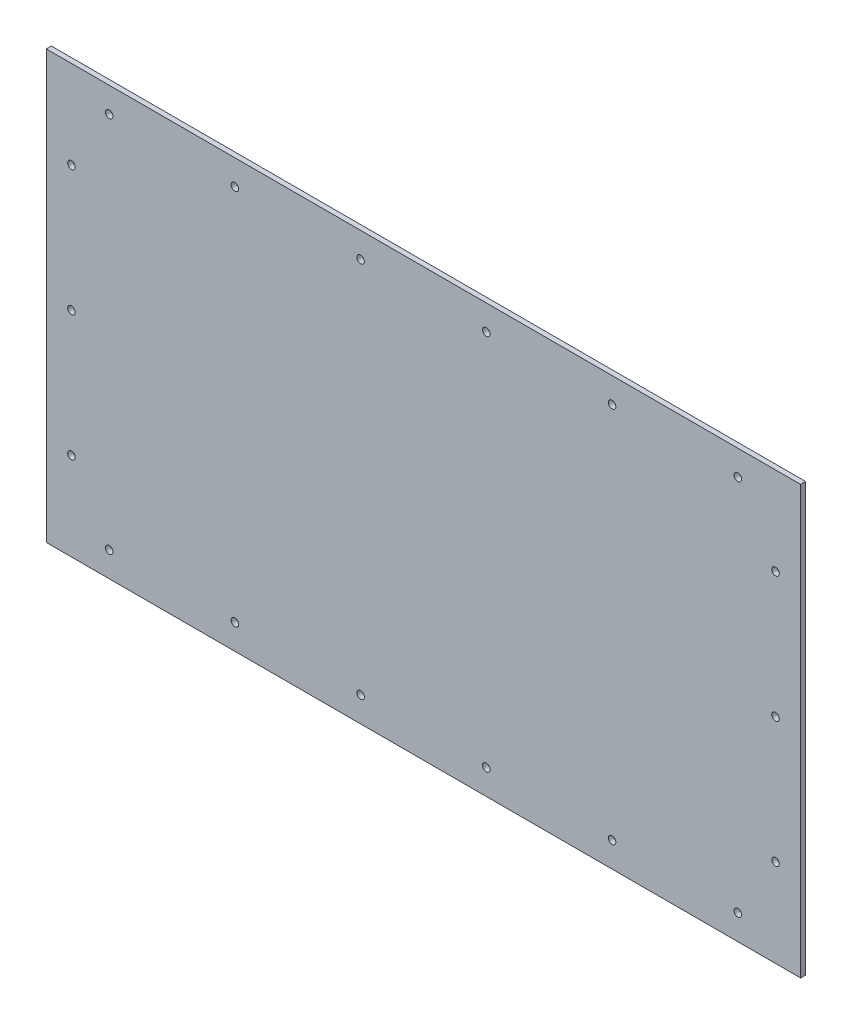
ISO-10303-21;
HEADER;
FILE_DESCRIPTION(('STEP AP214'),'2;1');
FILE_NAME('part.step','',(''),(''),'','','');
FILE_SCHEMA(('AUTOMOTIVE_DESIGN { 1 0 10303 214 1 1 1 1 }'));
ENDSEC;
DATA;
#1=APPLICATION_CONTEXT('core data for automotive mechanical design processes');
#2=APPLICATION_PROTOCOL_DEFINITION('international standard','automotive_design',2000,#1);
#3=PRODUCT_CONTEXT('',#1,'mechanical');
#4=PRODUCT('Part','Part','',(#3));
#5=PRODUCT_RELATED_PRODUCT_CATEGORY('part','',(#4));
#6=PRODUCT_DEFINITION_FORMATION('','',#4);
#7=PRODUCT_DEFINITION_CONTEXT('part definition',#1,'design');
#8=PRODUCT_DEFINITION('design','',#6,#7);
#9=PRODUCT_DEFINITION_SHAPE('','',#8);
#10=(LENGTH_UNIT() NAMED_UNIT(*) SI_UNIT(.MILLI.,.METRE.));
#11=(NAMED_UNIT(*) PLANE_ANGLE_UNIT() SI_UNIT($,.RADIAN.));
#12=(NAMED_UNIT(*) SI_UNIT($,.STERADIAN.) SOLID_ANGLE_UNIT());
#13=UNCERTAINTY_MEASURE_WITH_UNIT(LENGTH_MEASURE(1.E-05),#10,'distance_accuracy_value','');
#14=(GEOMETRIC_REPRESENTATION_CONTEXT(3) GLOBAL_UNCERTAINTY_ASSIGNED_CONTEXT((#13)) GLOBAL_UNIT_ASSIGNED_CONTEXT((#10,
#11,#12)) REPRESENTATION_CONTEXT('',''));
#15=CARTESIAN_POINT('',(0.,0.,0.));
#16=DIRECTION('',(0.,0.,1.));
#17=DIRECTION('',(1.,0.,0.));
#18=AXIS2_PLACEMENT_3D('',#15,#16,#17);
#19=CARTESIAN_POINT('',(150.,-85.,2.));
#20=DIRECTION('',(-1.,0.,0.));
#21=DIRECTION('',(0.,0.,1.));
#22=AXIS2_PLACEMENT_3D('',#19,#20,#21);
#23=PLANE('',#22);
#24=DIRECTION('',(0.,1.,0.));
#25=VECTOR('',#24,1.);
#26=CARTESIAN_POINT('',(150.,-85.,0.));
#27=LINE('',#26,#25);
#28=CARTESIAN_POINT('',(150.,-85.,0.));
#29=VERTEX_POINT('',#28);
#30=CARTESIAN_POINT('',(150.,85.,0.));
#31=VERTEX_POINT('',#30);
#32=EDGE_CURVE('E104',#29,#31,#27,.T.);
#33=ORIENTED_EDGE('',*,*,#32,.T.);
#34=DIRECTION('',(0.,0.,-1.));
#35=VECTOR('',#34,1.);
#36=CARTESIAN_POINT('',(150.,85.,2.));
#37=LINE('',#36,#35);
#38=CARTESIAN_POINT('',(150.,85.,2.));
#39=VERTEX_POINT('',#38);
#40=EDGE_CURVE('E95',#39,#31,#37,.T.);
#41=ORIENTED_EDGE('',*,*,#40,.F.);
#42=DIRECTION('',(0.,1.,0.));
#43=VECTOR('',#42,1.);
#44=CARTESIAN_POINT('',(150.,-85.,2.));
#45=LINE('',#44,#43);
#46=CARTESIAN_POINT('',(150.,-85.,2.));
#47=VERTEX_POINT('',#46);
#48=EDGE_CURVE('E89',#47,#39,#45,.T.);
#49=ORIENTED_EDGE('',*,*,#48,.F.);
#50=DIRECTION('',(0.,0.,-1.));
#51=VECTOR('',#50,1.);
#52=CARTESIAN_POINT('',(150.,-85.,2.));
#53=LINE('',#52,#51);
#54=EDGE_CURVE('E100',#47,#29,#53,.T.);
#55=ORIENTED_EDGE('',*,*,#54,.T.);
#56=EDGE_LOOP('',(#33,#41,#49,#55));
#57=FACE_BOUND('',#56,.T.);
#58=ADVANCED_FACE('F33',(#57),#23,.F.);
#59=CARTESIAN_POINT('',(-150.,85.,2.));
#60=DIRECTION('',(0.,-1.,0.));
#61=DIRECTION('',(0.,0.,-1.));
#62=AXIS2_PLACEMENT_3D('',#59,#60,#61);
#63=PLANE('',#62);
#64=DIRECTION('',(-1.,0.,0.));
#65=VECTOR('',#64,1.);
#66=CARTESIAN_POINT('',(-150.,85.,0.));
#67=LINE('',#66,#65);
#68=CARTESIAN_POINT('',(-150.,85.,0.));
#69=VERTEX_POINT('',#68);
#70=EDGE_CURVE('E94',#31,#69,#67,.T.);
#71=ORIENTED_EDGE('',*,*,#70,.T.);
#72=DIRECTION('',(0.,0.,-1.));
#73=VECTOR('',#72,1.);
#74=CARTESIAN_POINT('',(-150.,85.,2.));
#75=LINE('',#74,#73);
#76=CARTESIAN_POINT('',(-150.,85.,2.));
#77=VERTEX_POINT('',#76);
#78=EDGE_CURVE('E92',#77,#69,#75,.T.);
#79=ORIENTED_EDGE('',*,*,#78,.F.);
#80=DIRECTION('',(-1.,0.,0.));
#81=VECTOR('',#80,1.);
#82=CARTESIAN_POINT('',(-150.,85.,2.));
#83=LINE('',#82,#81);
#84=EDGE_CURVE('E83',#39,#77,#83,.T.);
#85=ORIENTED_EDGE('',*,*,#84,.F.);
#86=ORIENTED_EDGE('',*,*,#40,.T.);
#87=EDGE_LOOP('',(#71,#79,#85,#86));
#88=FACE_BOUND('',#87,.T.);
#89=ADVANCED_FACE('F93',(#88),#63,.F.);
#90=CARTESIAN_POINT('',(-150.,-85.,2.));
#91=DIRECTION('',(1.,0.,0.));
#92=DIRECTION('',(0.,0.,-1.));
#93=AXIS2_PLACEMENT_3D('',#90,#91,#92);
#94=PLANE('',#93);
#95=DIRECTION('',(0.,-1.,0.));
#96=VECTOR('',#95,1.);
#97=CARTESIAN_POINT('',(-150.,-85.,0.));
#98=LINE('',#97,#96);
#99=CARTESIAN_POINT('',(-150.,-85.,0.));
#100=VERTEX_POINT('',#99);
#101=EDGE_CURVE('E69',#69,#100,#98,.T.);
#102=ORIENTED_EDGE('',*,*,#101,.T.);
#103=DIRECTION('',(0.,0.,-1.));
#104=VECTOR('',#103,1.);
#105=CARTESIAN_POINT('',(-150.,-85.,2.));
#106=LINE('',#105,#104);
#107=CARTESIAN_POINT('',(-150.,-85.,2.));
#108=VERTEX_POINT('',#107);
#109=EDGE_CURVE('E96',#108,#100,#106,.T.);
#110=ORIENTED_EDGE('',*,*,#109,.F.);
#111=DIRECTION('',(0.,-1.,0.));
#112=VECTOR('',#111,1.);
#113=CARTESIAN_POINT('',(-150.,-85.,2.));
#114=LINE('',#113,#112);
#115=EDGE_CURVE('E87',#77,#108,#114,.T.);
#116=ORIENTED_EDGE('',*,*,#115,.F.);
#117=ORIENTED_EDGE('',*,*,#78,.T.);
#118=EDGE_LOOP('',(#102,#110,#116,#117));
#119=FACE_BOUND('',#118,.T.);
#120=ADVANCED_FACE('F98',(#119),#94,.F.);
#121=CARTESIAN_POINT('',(-150.,-85.,2.));
#122=DIRECTION('',(0.,1.,0.));
#123=DIRECTION('',(0.,0.,1.));
#124=AXIS2_PLACEMENT_3D('',#121,#122,#123);
#125=PLANE('',#124);
#126=DIRECTION('',(1.,0.,0.));
#127=VECTOR('',#126,1.);
#128=CARTESIAN_POINT('',(-150.,-85.,0.));
#129=LINE('',#128,#127);
#130=EDGE_CURVE('E75',#100,#29,#129,.T.);
#131=ORIENTED_EDGE('',*,*,#130,.T.);
#132=ORIENTED_EDGE('',*,*,#54,.F.);
#133=DIRECTION('',(1.,0.,0.));
#134=VECTOR('',#133,1.);
#135=CARTESIAN_POINT('',(-150.,-85.,2.));
#136=LINE('',#135,#134);
#137=EDGE_CURVE('E52',#108,#47,#136,.T.);
#138=ORIENTED_EDGE('',*,*,#137,.F.);
#139=ORIENTED_EDGE('',*,*,#109,.T.);
#140=EDGE_LOOP('',(#131,#132,#138,#139));
#141=FACE_BOUND('',#140,.T.);
#142=ADVANCED_FACE('F187',(#141),#125,.F.);
#143=CARTESIAN_POINT('',(150.,85.,2.));
#144=DIRECTION('',(0.,0.,-1.));
#145=DIRECTION('',(-1.,0.,0.));
#146=AXIS2_PLACEMENT_3D('',#143,#144,#145);
#147=PLANE('',#146);
#148=CARTESIAN_POINT('',(140.000000000002,-50.,2.));
#149=DIRECTION('',(0.,0.,1.));
#150=DIRECTION('',(1.,0.,0.));
#151=AXIS2_PLACEMENT_3D('',#148,#149,#150);
#152=CIRCLE('',#151,1.5);
#153=CARTESIAN_POINT('',(141.500000000002,-50.,2.));
#154=VERTEX_POINT('',#153);
#155=EDGE_CURVE('E492',#154,#154,#152,.T.);
#156=ORIENTED_EDGE('',*,*,#155,.F.);
#157=EDGE_LOOP('',(#156));
#158=FACE_BOUND('',#157,.T.);
#159=CARTESIAN_POINT('',(140.000000000001,0.,2.));
#160=DIRECTION('',(0.,0.,1.));
#161=DIRECTION('',(1.,0.,0.));
#162=AXIS2_PLACEMENT_3D('',#159,#160,#161);
#163=CIRCLE('',#162,1.5);
#164=CARTESIAN_POINT('',(141.500000000001,0.,2.));
#165=VERTEX_POINT('',#164);
#166=EDGE_CURVE('E494',#165,#165,#163,.T.);
#167=ORIENTED_EDGE('',*,*,#166,.F.);
#168=EDGE_LOOP('',(#167));
#169=FACE_BOUND('',#168,.T.);
#170=CARTESIAN_POINT('',(140.,50.,2.));
#171=DIRECTION('',(0.,0.,1.));
#172=DIRECTION('',(1.,0.,0.));
#173=AXIS2_PLACEMENT_3D('',#170,#171,#172);
#174=CIRCLE('',#173,1.5);
#175=CARTESIAN_POINT('',(141.5,50.,2.));
#176=VERTEX_POINT('',#175);
#177=EDGE_CURVE('E500',#176,#176,#174,.T.);
#178=ORIENTED_EDGE('',*,*,#177,.F.);
#179=EDGE_LOOP('',(#178));
#180=FACE_BOUND('',#179,.T.);
#181=CARTESIAN_POINT('',(-139.999999999998,-50.,2.));
#182=DIRECTION('',(0.,0.,1.));
#183=DIRECTION('',(1.,0.,0.));
#184=AXIS2_PLACEMENT_3D('',#181,#182,#183);
#185=CIRCLE('',#184,1.5);
#186=CARTESIAN_POINT('',(-138.499999999998,-50.,2.));
#187=VERTEX_POINT('',#186);
#188=EDGE_CURVE('E506',#187,#187,#185,.T.);
#189=ORIENTED_EDGE('',*,*,#188,.F.);
#190=EDGE_LOOP('',(#189));
#191=FACE_BOUND('',#190,.T.);
#192=CARTESIAN_POINT('',(-139.999999999999,0.,2.));
#193=DIRECTION('',(0.,0.,1.));
#194=DIRECTION('',(1.,0.,0.));
#195=AXIS2_PLACEMENT_3D('',#192,#193,#194);
#196=CIRCLE('',#195,1.5);
#197=CARTESIAN_POINT('',(-138.499999999999,0.,2.));
#198=VERTEX_POINT('',#197);
#199=EDGE_CURVE('E512',#198,#198,#196,.T.);
#200=ORIENTED_EDGE('',*,*,#199,.F.);
#201=EDGE_LOOP('',(#200));
#202=FACE_BOUND('',#201,.T.);
#203=CARTESIAN_POINT('',(-140.,50.,2.));
#204=DIRECTION('',(0.,0.,1.));
#205=DIRECTION('',(1.,0.,0.));
#206=AXIS2_PLACEMENT_3D('',#203,#204,#205);
#207=CIRCLE('',#206,1.5);
#208=CARTESIAN_POINT('',(-138.5,50.,2.));
#209=VERTEX_POINT('',#208);
#210=EDGE_CURVE('E518',#209,#209,#207,.T.);
#211=ORIENTED_EDGE('',*,*,#210,.F.);
#212=EDGE_LOOP('',(#211));
#213=FACE_BOUND('',#212,.T.);
#214=CARTESIAN_POINT('',(125.,-75.,2.));
#215=DIRECTION('',(0.,0.,1.));
#216=DIRECTION('',(1.,0.,0.));
#217=AXIS2_PLACEMENT_3D('',#214,#215,#216);
#218=CIRCLE('',#217,1.5);
#219=CARTESIAN_POINT('',(126.5,-75.,2.));
#220=VERTEX_POINT('',#219);
#221=EDGE_CURVE('E165',#220,#220,#218,.T.);
#222=ORIENTED_EDGE('',*,*,#221,.F.);
#223=EDGE_LOOP('',(#222));
#224=FACE_BOUND('',#223,.T.);
#225=CARTESIAN_POINT('',(75.,-75.,2.));
#226=DIRECTION('',(0.,0.,1.));
#227=DIRECTION('',(1.,0.,0.));
#228=AXIS2_PLACEMENT_3D('',#225,#226,#227);
#229=CIRCLE('',#228,1.5);
#230=CARTESIAN_POINT('',(76.5,-75.,2.));
#231=VERTEX_POINT('',#230);
#232=EDGE_CURVE('E155',#231,#231,#229,.T.);
#233=ORIENTED_EDGE('',*,*,#232,.F.);
#234=EDGE_LOOP('',(#233));
#235=FACE_BOUND('',#234,.T.);
#236=CARTESIAN_POINT('',(25.,-75.,2.));
#237=DIRECTION('',(0.,0.,1.));
#238=DIRECTION('',(1.,0.,0.));
#239=AXIS2_PLACEMENT_3D('',#236,#237,#238);
#240=CIRCLE('',#239,1.5);
#241=CARTESIAN_POINT('',(26.5,-75.,2.));
#242=VERTEX_POINT('',#241);
#243=EDGE_CURVE('E152',#242,#242,#240,.T.);
#244=ORIENTED_EDGE('',*,*,#243,.F.);
#245=EDGE_LOOP('',(#244));
#246=FACE_BOUND('',#245,.T.);
#247=CARTESIAN_POINT('',(-25.,-75.,2.));
#248=DIRECTION('',(0.,0.,1.));
#249=DIRECTION('',(1.,0.,0.));
#250=AXIS2_PLACEMENT_3D('',#247,#248,#249);
#251=CIRCLE('',#250,1.5);
#252=CARTESIAN_POINT('',(-23.5000000000001,-75.,2.));
#253=VERTEX_POINT('',#252);
#254=EDGE_CURVE('E149',#253,#253,#251,.T.);
#255=ORIENTED_EDGE('',*,*,#254,.F.);
#256=EDGE_LOOP('',(#255));
#257=FACE_BOUND('',#256,.T.);
#258=CARTESIAN_POINT('',(-75.0000000000001,-75.,2.));
#259=DIRECTION('',(0.,0.,1.));
#260=DIRECTION('',(1.,0.,0.));
#261=AXIS2_PLACEMENT_3D('',#258,#259,#260);
#262=CIRCLE('',#261,1.5);
#263=CARTESIAN_POINT('',(-73.5000000000001,-75.,2.));
#264=VERTEX_POINT('',#263);
#265=EDGE_CURVE('E145',#264,#264,#262,.T.);
#266=ORIENTED_EDGE('',*,*,#265,.F.);
#267=EDGE_LOOP('',(#266));
#268=FACE_BOUND('',#267,.T.);
#269=CARTESIAN_POINT('',(-125.,-75.,2.));
#270=DIRECTION('',(0.,0.,1.));
#271=DIRECTION('',(1.,0.,0.));
#272=AXIS2_PLACEMENT_3D('',#269,#270,#271);
#273=CIRCLE('',#272,1.5);
#274=CARTESIAN_POINT('',(-123.5,-75.,2.));
#275=VERTEX_POINT('',#274);
#276=EDGE_CURVE('E141',#275,#275,#273,.T.);
#277=ORIENTED_EDGE('',*,*,#276,.F.);
#278=EDGE_LOOP('',(#277));
#279=FACE_BOUND('',#278,.T.);
#280=CARTESIAN_POINT('',(-75.0000000000001,75.,2.));
#281=DIRECTION('',(0.,0.,1.));
#282=DIRECTION('',(1.,0.,0.));
#283=AXIS2_PLACEMENT_3D('',#280,#281,#282);
#284=CIRCLE('',#283,1.5);
#285=CARTESIAN_POINT('',(-73.5000000000001,75.,2.));
#286=VERTEX_POINT('',#285);
#287=EDGE_CURVE('E177',#286,#286,#284,.T.);
#288=ORIENTED_EDGE('',*,*,#287,.F.);
#289=EDGE_LOOP('',(#288));
#290=FACE_BOUND('',#289,.T.);
#291=CARTESIAN_POINT('',(-125.,75.,2.));
#292=DIRECTION('',(0.,0.,1.));
#293=DIRECTION('',(1.,0.,0.));
#294=AXIS2_PLACEMENT_3D('',#291,#292,#293);
#295=CIRCLE('',#294,1.5);
#296=CARTESIAN_POINT('',(-123.5,75.,2.));
#297=VERTEX_POINT('',#296);
#298=EDGE_CURVE('E117',#297,#297,#295,.T.);
#299=ORIENTED_EDGE('',*,*,#298,.F.);
#300=EDGE_LOOP('',(#299));
#301=FACE_BOUND('',#300,.T.);
#302=ORIENTED_EDGE('',*,*,#48,.T.);
#303=ORIENTED_EDGE('',*,*,#84,.T.);
#304=ORIENTED_EDGE('',*,*,#115,.T.);
#305=ORIENTED_EDGE('',*,*,#137,.T.);
#306=EDGE_LOOP('',(#302,#303,#304,#305));
#307=FACE_BOUND('',#306,.T.);
#308=CARTESIAN_POINT('',(-25.,75.,2.));
#309=DIRECTION('',(0.,0.,1.));
#310=DIRECTION('',(1.,0.,0.));
#311=AXIS2_PLACEMENT_3D('',#308,#309,#310);
#312=CIRCLE('',#311,1.5);
#313=CARTESIAN_POINT('',(-23.5000000000001,75.,2.));
#314=VERTEX_POINT('',#313);
#315=EDGE_CURVE('E120',#314,#314,#312,.T.);
#316=ORIENTED_EDGE('',*,*,#315,.F.);
#317=EDGE_LOOP('',(#316));
#318=FACE_BOUND('',#317,.T.);
#319=CARTESIAN_POINT('',(25.,75.,2.));
#320=DIRECTION('',(0.,0.,1.));
#321=DIRECTION('',(1.,0.,0.));
#322=AXIS2_PLACEMENT_3D('',#319,#320,#321);
#323=CIRCLE('',#322,1.5);
#324=CARTESIAN_POINT('',(26.5,75.,2.));
#325=VERTEX_POINT('',#324);
#326=EDGE_CURVE('E126',#325,#325,#323,.T.);
#327=ORIENTED_EDGE('',*,*,#326,.F.);
#328=EDGE_LOOP('',(#327));
#329=FACE_BOUND('',#328,.T.);
#330=CARTESIAN_POINT('',(75.,75.,2.));
#331=DIRECTION('',(0.,0.,1.));
#332=DIRECTION('',(1.,0.,0.));
#333=AXIS2_PLACEMENT_3D('',#330,#331,#332);
#334=CIRCLE('',#333,1.5);
#335=CARTESIAN_POINT('',(76.5,75.,2.));
#336=VERTEX_POINT('',#335);
#337=EDGE_CURVE('E132',#336,#336,#334,.T.);
#338=ORIENTED_EDGE('',*,*,#337,.F.);
#339=EDGE_LOOP('',(#338));
#340=FACE_BOUND('',#339,.T.);
#341=CARTESIAN_POINT('',(125.,75.,2.));
#342=DIRECTION('',(0.,0.,1.));
#343=DIRECTION('',(1.,0.,0.));
#344=AXIS2_PLACEMENT_3D('',#341,#342,#343);
#345=CIRCLE('',#344,1.5);
#346=CARTESIAN_POINT('',(126.5,75.,2.));
#347=VERTEX_POINT('',#346);
#348=EDGE_CURVE('E11',#347,#347,#345,.T.);
#349=ORIENTED_EDGE('',*,*,#348,.F.);
#350=EDGE_LOOP('',(#349));
#351=FACE_BOUND('',#350,.T.);
#352=ADVANCED_FACE('F84',(#158,#169,#180,#191,#202,#213,#224,#235,#246,#257,#268,#279,#290,#301,
#307,#318,#329,#340,#351),#147,.F.);
#353=CARTESIAN_POINT('',(150.,85.,0.));
#354=DIRECTION('',(0.,0.,-1.));
#355=DIRECTION('',(-1.,0.,0.));
#356=AXIS2_PLACEMENT_3D('',#353,#354,#355);
#357=PLANE('',#356);
#358=CARTESIAN_POINT('',(140.000000000002,-50.,0.));
#359=DIRECTION('',(0.,0.,1.));
#360=DIRECTION('',(1.,0.,0.));
#361=AXIS2_PLACEMENT_3D('',#358,#359,#360);
#362=CIRCLE('',#361,1.5);
#363=CARTESIAN_POINT('',(141.500000000002,-50.,0.));
#364=VERTEX_POINT('',#363);
#365=EDGE_CURVE('E490',#364,#364,#362,.T.);
#366=ORIENTED_EDGE('',*,*,#365,.T.);
#367=EDGE_LOOP('',(#366));
#368=FACE_BOUND('',#367,.T.);
#369=CARTESIAN_POINT('',(140.000000000001,0.,0.));
#370=DIRECTION('',(0.,0.,1.));
#371=DIRECTION('',(1.,0.,0.));
#372=AXIS2_PLACEMENT_3D('',#369,#370,#371);
#373=CIRCLE('',#372,1.5);
#374=CARTESIAN_POINT('',(141.500000000001,0.,0.));
#375=VERTEX_POINT('',#374);
#376=EDGE_CURVE('E497',#375,#375,#373,.T.);
#377=ORIENTED_EDGE('',*,*,#376,.T.);
#378=EDGE_LOOP('',(#377));
#379=FACE_BOUND('',#378,.T.);
#380=CARTESIAN_POINT('',(140.,50.,0.));
#381=DIRECTION('',(0.,0.,1.));
#382=DIRECTION('',(1.,0.,0.));
#383=AXIS2_PLACEMENT_3D('',#380,#381,#382);
#384=CIRCLE('',#383,1.5);
#385=CARTESIAN_POINT('',(141.5,50.,0.));
#386=VERTEX_POINT('',#385);
#387=EDGE_CURVE('E503',#386,#386,#384,.T.);
#388=ORIENTED_EDGE('',*,*,#387,.T.);
#389=EDGE_LOOP('',(#388));
#390=FACE_BOUND('',#389,.T.);
#391=CARTESIAN_POINT('',(-139.999999999998,-50.,0.));
#392=DIRECTION('',(0.,0.,1.));
#393=DIRECTION('',(1.,0.,0.));
#394=AXIS2_PLACEMENT_3D('',#391,#392,#393);
#395=CIRCLE('',#394,1.5);
#396=CARTESIAN_POINT('',(-138.499999999998,-50.,0.));
#397=VERTEX_POINT('',#396);
#398=EDGE_CURVE('E509',#397,#397,#395,.T.);
#399=ORIENTED_EDGE('',*,*,#398,.T.);
#400=EDGE_LOOP('',(#399));
#401=FACE_BOUND('',#400,.T.);
#402=CARTESIAN_POINT('',(-139.999999999999,0.,0.));
#403=DIRECTION('',(0.,0.,1.));
#404=DIRECTION('',(1.,0.,0.));
#405=AXIS2_PLACEMENT_3D('',#402,#403,#404);
#406=CIRCLE('',#405,1.5);
#407=CARTESIAN_POINT('',(-138.499999999999,0.,0.));
#408=VERTEX_POINT('',#407);
#409=EDGE_CURVE('E515',#408,#408,#406,.T.);
#410=ORIENTED_EDGE('',*,*,#409,.T.);
#411=EDGE_LOOP('',(#410));
#412=FACE_BOUND('',#411,.T.);
#413=CARTESIAN_POINT('',(-140.,50.,0.));
#414=DIRECTION('',(0.,0.,1.));
#415=DIRECTION('',(1.,0.,0.));
#416=AXIS2_PLACEMENT_3D('',#413,#414,#415);
#417=CIRCLE('',#416,1.5);
#418=CARTESIAN_POINT('',(-138.5,50.,0.));
#419=VERTEX_POINT('',#418);
#420=EDGE_CURVE('E521',#419,#419,#417,.T.);
#421=ORIENTED_EDGE('',*,*,#420,.T.);
#422=EDGE_LOOP('',(#421));
#423=FACE_BOUND('',#422,.T.);
#424=CARTESIAN_POINT('',(125.,-75.,0.));
#425=DIRECTION('',(0.,0.,-1.));
#426=DIRECTION('',(-1.,0.,0.));
#427=AXIS2_PLACEMENT_3D('',#424,#425,#426);
#428=CIRCLE('',#427,1.5);
#429=CARTESIAN_POINT('',(123.5,-75.,0.));
#430=VERTEX_POINT('',#429);
#431=EDGE_CURVE('E37',#430,#430,#428,.T.);
#432=ORIENTED_EDGE('',*,*,#431,.F.);
#433=EDGE_LOOP('',(#432));
#434=FACE_BOUND('',#433,.T.);
#435=CARTESIAN_POINT('',(75.,-75.,0.));
#436=DIRECTION('',(0.,0.,-1.));
#437=DIRECTION('',(-1.,0.,0.));
#438=AXIS2_PLACEMENT_3D('',#435,#436,#437);
#439=CIRCLE('',#438,1.5);
#440=CARTESIAN_POINT('',(73.5,-75.,0.));
#441=VERTEX_POINT('',#440);
#442=EDGE_CURVE('E153',#441,#441,#439,.T.);
#443=ORIENTED_EDGE('',*,*,#442,.F.);
#444=EDGE_LOOP('',(#443));
#445=FACE_BOUND('',#444,.T.);
#446=CARTESIAN_POINT('',(25.,-75.,0.));
#447=DIRECTION('',(0.,0.,-1.));
#448=DIRECTION('',(-1.,0.,0.));
#449=AXIS2_PLACEMENT_3D('',#446,#447,#448);
#450=CIRCLE('',#449,1.5);
#451=CARTESIAN_POINT('',(23.5,-75.,0.));
#452=VERTEX_POINT('',#451);
#453=EDGE_CURVE('E150',#452,#452,#450,.T.);
#454=ORIENTED_EDGE('',*,*,#453,.F.);
#455=EDGE_LOOP('',(#454));
#456=FACE_BOUND('',#455,.T.);
#457=CARTESIAN_POINT('',(-25.,-75.,0.));
#458=DIRECTION('',(0.,0.,-1.));
#459=DIRECTION('',(-1.,0.,0.));
#460=AXIS2_PLACEMENT_3D('',#457,#458,#459);
#461=CIRCLE('',#460,1.5);
#462=CARTESIAN_POINT('',(-26.5,-75.,0.));
#463=VERTEX_POINT('',#462);
#464=EDGE_CURVE('E146',#463,#463,#461,.T.);
#465=ORIENTED_EDGE('',*,*,#464,.F.);
#466=EDGE_LOOP('',(#465));
#467=FACE_BOUND('',#466,.T.);
#468=CARTESIAN_POINT('',(-75.0000000000001,-75.,0.));
#469=DIRECTION('',(0.,0.,-1.));
#470=DIRECTION('',(-1.,0.,0.));
#471=AXIS2_PLACEMENT_3D('',#468,#469,#470);
#472=CIRCLE('',#471,1.5);
#473=CARTESIAN_POINT('',(-76.5000000000001,-75.,0.));
#474=VERTEX_POINT('',#473);
#475=EDGE_CURVE('E142',#474,#474,#472,.T.);
#476=ORIENTED_EDGE('',*,*,#475,.F.);
#477=EDGE_LOOP('',(#476));
#478=FACE_BOUND('',#477,.T.);
#479=CARTESIAN_POINT('',(-125.,-75.,0.));
#480=DIRECTION('',(0.,0.,-1.));
#481=DIRECTION('',(-1.,0.,0.));
#482=AXIS2_PLACEMENT_3D('',#479,#480,#481);
#483=CIRCLE('',#482,1.5);
#484=CARTESIAN_POINT('',(-126.5,-75.,0.));
#485=VERTEX_POINT('',#484);
#486=EDGE_CURVE('E137',#485,#485,#483,.T.);
#487=ORIENTED_EDGE('',*,*,#486,.F.);
#488=EDGE_LOOP('',(#487));
#489=FACE_BOUND('',#488,.T.);
#490=CARTESIAN_POINT('',(-75.0000000000001,75.,0.));
#491=DIRECTION('',(0.,0.,-1.));
#492=DIRECTION('',(-1.,0.,0.));
#493=AXIS2_PLACEMENT_3D('',#490,#491,#492);
#494=CIRCLE('',#493,1.5);
#495=CARTESIAN_POINT('',(-76.5000000000001,75.,0.));
#496=VERTEX_POINT('',#495);
#497=EDGE_CURVE('E140',#496,#496,#494,.T.);
#498=ORIENTED_EDGE('',*,*,#497,.F.);
#499=EDGE_LOOP('',(#498));
#500=FACE_BOUND('',#499,.T.);
#501=CARTESIAN_POINT('',(-125.,75.,0.));
#502=DIRECTION('',(0.,0.,-1.));
#503=DIRECTION('',(-1.,0.,0.));
#504=AXIS2_PLACEMENT_3D('',#501,#502,#503);
#505=CIRCLE('',#504,1.5);
#506=CARTESIAN_POINT('',(-126.5,75.,0.));
#507=VERTEX_POINT('',#506);
#508=EDGE_CURVE('E107',#507,#507,#505,.T.);
#509=ORIENTED_EDGE('',*,*,#508,.F.);
#510=EDGE_LOOP('',(#509));
#511=FACE_BOUND('',#510,.T.);
#512=ORIENTED_EDGE('',*,*,#32,.F.);
#513=ORIENTED_EDGE('',*,*,#130,.F.);
#514=ORIENTED_EDGE('',*,*,#101,.F.);
#515=ORIENTED_EDGE('',*,*,#70,.F.);
#516=EDGE_LOOP('',(#512,#513,#514,#515));
#517=FACE_BOUND('',#516,.T.);
#518=CARTESIAN_POINT('',(-25.,75.,0.));
#519=DIRECTION('',(0.,0.,-1.));
#520=DIRECTION('',(-1.,0.,0.));
#521=AXIS2_PLACEMENT_3D('',#518,#519,#520);
#522=CIRCLE('',#521,1.5);
#523=CARTESIAN_POINT('',(-26.5,75.,0.));
#524=VERTEX_POINT('',#523);
#525=EDGE_CURVE('E114',#524,#524,#522,.T.);
#526=ORIENTED_EDGE('',*,*,#525,.F.);
#527=EDGE_LOOP('',(#526));
#528=FACE_BOUND('',#527,.T.);
#529=CARTESIAN_POINT('',(25.,75.,0.));
#530=DIRECTION('',(0.,0.,-1.));
#531=DIRECTION('',(-1.,0.,0.));
#532=AXIS2_PLACEMENT_3D('',#529,#530,#531);
#533=CIRCLE('',#532,1.5);
#534=CARTESIAN_POINT('',(23.5,75.,0.));
#535=VERTEX_POINT('',#534);
#536=EDGE_CURVE('E123',#535,#535,#533,.T.);
#537=ORIENTED_EDGE('',*,*,#536,.F.);
#538=EDGE_LOOP('',(#537));
#539=FACE_BOUND('',#538,.T.);
#540=CARTESIAN_POINT('',(75.,75.,0.));
#541=DIRECTION('',(0.,0.,-1.));
#542=DIRECTION('',(-1.,0.,0.));
#543=AXIS2_PLACEMENT_3D('',#540,#541,#542);
#544=CIRCLE('',#543,1.5);
#545=CARTESIAN_POINT('',(73.5,75.,0.));
#546=VERTEX_POINT('',#545);
#547=EDGE_CURVE('E129',#546,#546,#544,.T.);
#548=ORIENTED_EDGE('',*,*,#547,.F.);
#549=EDGE_LOOP('',(#548));
#550=FACE_BOUND('',#549,.T.);
#551=CARTESIAN_POINT('',(125.,75.,0.));
#552=DIRECTION('',(0.,0.,-1.));
#553=DIRECTION('',(-1.,0.,0.));
#554=AXIS2_PLACEMENT_3D('',#551,#552,#553);
#555=CIRCLE('',#554,1.5);
#556=CARTESIAN_POINT('',(123.5,75.,0.));
#557=VERTEX_POINT('',#556);
#558=EDGE_CURVE('E43',#557,#557,#555,.T.);
#559=ORIENTED_EDGE('',*,*,#558,.F.);
#560=EDGE_LOOP('',(#559));
#561=FACE_BOUND('',#560,.T.);
#562=ADVANCED_FACE('F186',(#368,#379,#390,#401,#412,#423,#434,#445,#456,#467,#478,#489,#500,
#511,#517,#528,#539,#550,#561),#357,.T.);
#563=CARTESIAN_POINT('',(-125.,75.,-8.));
#564=DIRECTION('',(0.,0.,1.));
#565=DIRECTION('',(1.,0.,0.));
#566=AXIS2_PLACEMENT_3D('',#563,#564,#565);
#567=CYLINDRICAL_SURFACE('',#566,1.5);
#568=ORIENTED_EDGE('',*,*,#508,.T.);
#569=EDGE_LOOP('',(#568));
#570=FACE_BOUND('',#569,.T.);
#571=ORIENTED_EDGE('',*,*,#298,.T.);
#572=EDGE_LOOP('',(#571));
#573=FACE_BOUND('',#572,.T.);
#574=ADVANCED_FACE('F183',(#570,#573),#567,.F.);
#575=CARTESIAN_POINT('',(-75.0000000000001,75.,-8.));
#576=DIRECTION('',(0.,0.,1.));
#577=DIRECTION('',(1.,0.,0.));
#578=AXIS2_PLACEMENT_3D('',#575,#576,#577);
#579=CYLINDRICAL_SURFACE('',#578,1.5);
#580=ORIENTED_EDGE('',*,*,#497,.T.);
#581=EDGE_LOOP('',(#580));
#582=FACE_BOUND('',#581,.T.);
#583=ORIENTED_EDGE('',*,*,#287,.T.);
#584=EDGE_LOOP('',(#583));
#585=FACE_BOUND('',#584,.T.);
#586=ADVANCED_FACE('F213',(#582,#585),#579,.F.);
#587=CARTESIAN_POINT('',(-25.,75.,-8.));
#588=DIRECTION('',(0.,0.,1.));
#589=DIRECTION('',(1.,0.,0.));
#590=AXIS2_PLACEMENT_3D('',#587,#588,#589);
#591=CYLINDRICAL_SURFACE('',#590,1.5);
#592=ORIENTED_EDGE('',*,*,#525,.T.);
#593=EDGE_LOOP('',(#592));
#594=FACE_BOUND('',#593,.T.);
#595=ORIENTED_EDGE('',*,*,#315,.T.);
#596=EDGE_LOOP('',(#595));
#597=FACE_BOUND('',#596,.T.);
#598=ADVANCED_FACE('F209',(#594,#597),#591,.F.);
#599=CARTESIAN_POINT('',(25.,75.,-8.));
#600=DIRECTION('',(0.,0.,1.));
#601=DIRECTION('',(1.,0.,0.));
#602=AXIS2_PLACEMENT_3D('',#599,#600,#601);
#603=CYLINDRICAL_SURFACE('',#602,1.5);
#604=ORIENTED_EDGE('',*,*,#536,.T.);
#605=EDGE_LOOP('',(#604));
#606=FACE_BOUND('',#605,.T.);
#607=ORIENTED_EDGE('',*,*,#326,.T.);
#608=EDGE_LOOP('',(#607));
#609=FACE_BOUND('',#608,.T.);
#610=ADVANCED_FACE('F212',(#606,#609),#603,.F.);
#611=CARTESIAN_POINT('',(75.,75.,-8.));
#612=DIRECTION('',(0.,0.,1.));
#613=DIRECTION('',(1.,0.,0.));
#614=AXIS2_PLACEMENT_3D('',#611,#612,#613);
#615=CYLINDRICAL_SURFACE('',#614,1.5);
#616=ORIENTED_EDGE('',*,*,#547,.T.);
#617=EDGE_LOOP('',(#616));
#618=FACE_BOUND('',#617,.T.);
#619=ORIENTED_EDGE('',*,*,#337,.T.);
#620=EDGE_LOOP('',(#619));
#621=FACE_BOUND('',#620,.T.);
#622=ADVANCED_FACE('F216',(#618,#621),#615,.F.);
#623=CARTESIAN_POINT('',(125.,75.,-8.));
#624=DIRECTION('',(0.,0.,1.));
#625=DIRECTION('',(1.,0.,0.));
#626=AXIS2_PLACEMENT_3D('',#623,#624,#625);
#627=CYLINDRICAL_SURFACE('',#626,1.5);
#628=ORIENTED_EDGE('',*,*,#558,.T.);
#629=EDGE_LOOP('',(#628));
#630=FACE_BOUND('',#629,.T.);
#631=ORIENTED_EDGE('',*,*,#348,.T.);
#632=EDGE_LOOP('',(#631));
#633=FACE_BOUND('',#632,.T.);
#634=ADVANCED_FACE('F35',(#630,#633),#627,.F.);
#635=CARTESIAN_POINT('',(-125.,-75.,-8.));
#636=DIRECTION('',(0.,0.,1.));
#637=DIRECTION('',(1.,0.,0.));
#638=AXIS2_PLACEMENT_3D('',#635,#636,#637);
#639=CYLINDRICAL_SURFACE('',#638,1.5);
#640=ORIENTED_EDGE('',*,*,#486,.T.);
#641=EDGE_LOOP('',(#640));
#642=FACE_BOUND('',#641,.T.);
#643=ORIENTED_EDGE('',*,*,#276,.T.);
#644=EDGE_LOOP('',(#643));
#645=FACE_BOUND('',#644,.T.);
#646=ADVANCED_FACE('F223',(#642,#645),#639,.F.);
#647=CARTESIAN_POINT('',(-75.0000000000001,-75.,-8.));
#648=DIRECTION('',(0.,0.,1.));
#649=DIRECTION('',(1.,0.,0.));
#650=AXIS2_PLACEMENT_3D('',#647,#648,#649);
#651=CYLINDRICAL_SURFACE('',#650,1.5);
#652=ORIENTED_EDGE('',*,*,#475,.T.);
#653=EDGE_LOOP('',(#652));
#654=FACE_BOUND('',#653,.T.);
#655=ORIENTED_EDGE('',*,*,#265,.T.);
#656=EDGE_LOOP('',(#655));
#657=FACE_BOUND('',#656,.T.);
#658=ADVANCED_FACE('F238',(#654,#657),#651,.F.);
#659=CARTESIAN_POINT('',(-25.,-75.,-8.));
#660=DIRECTION('',(0.,0.,1.));
#661=DIRECTION('',(1.,0.,0.));
#662=AXIS2_PLACEMENT_3D('',#659,#660,#661);
#663=CYLINDRICAL_SURFACE('',#662,1.5);
#664=ORIENTED_EDGE('',*,*,#464,.T.);
#665=EDGE_LOOP('',(#664));
#666=FACE_BOUND('',#665,.T.);
#667=ORIENTED_EDGE('',*,*,#254,.T.);
#668=EDGE_LOOP('',(#667));
#669=FACE_BOUND('',#668,.T.);
#670=ADVANCED_FACE('F244',(#666,#669),#663,.F.);
#671=CARTESIAN_POINT('',(25.,-75.,-8.));
#672=DIRECTION('',(0.,0.,1.));
#673=DIRECTION('',(1.,0.,0.));
#674=AXIS2_PLACEMENT_3D('',#671,#672,#673);
#675=CYLINDRICAL_SURFACE('',#674,1.5);
#676=ORIENTED_EDGE('',*,*,#453,.T.);
#677=EDGE_LOOP('',(#676));
#678=FACE_BOUND('',#677,.T.);
#679=ORIENTED_EDGE('',*,*,#243,.T.);
#680=EDGE_LOOP('',(#679));
#681=FACE_BOUND('',#680,.T.);
#682=ADVANCED_FACE('F316',(#678,#681),#675,.F.);
#683=CARTESIAN_POINT('',(75.,-75.,-8.));
#684=DIRECTION('',(0.,0.,1.));
#685=DIRECTION('',(1.,0.,0.));
#686=AXIS2_PLACEMENT_3D('',#683,#684,#685);
#687=CYLINDRICAL_SURFACE('',#686,1.5);
#688=ORIENTED_EDGE('',*,*,#442,.T.);
#689=EDGE_LOOP('',(#688));
#690=FACE_BOUND('',#689,.T.);
#691=ORIENTED_EDGE('',*,*,#232,.T.);
#692=EDGE_LOOP('',(#691));
#693=FACE_BOUND('',#692,.T.);
#694=ADVANCED_FACE('F326',(#690,#693),#687,.F.);
#695=CARTESIAN_POINT('',(125.,-75.,-8.));
#696=DIRECTION('',(0.,0.,1.));
#697=DIRECTION('',(1.,0.,0.));
#698=AXIS2_PLACEMENT_3D('',#695,#696,#697);
#699=CYLINDRICAL_SURFACE('',#698,1.5);
#700=ORIENTED_EDGE('',*,*,#431,.T.);
#701=EDGE_LOOP('',(#700));
#702=FACE_BOUND('',#701,.T.);
#703=ORIENTED_EDGE('',*,*,#221,.T.);
#704=EDGE_LOOP('',(#703));
#705=FACE_BOUND('',#704,.T.);
#706=ADVANCED_FACE('F337',(#702,#705),#699,.F.);
#707=CARTESIAN_POINT('',(-140.,50.,0.));
#708=DIRECTION('',(0.,0.,1.));
#709=DIRECTION('',(1.,0.,0.));
#710=AXIS2_PLACEMENT_3D('',#707,#708,#709);
#711=CYLINDRICAL_SURFACE('',#710,1.5);
#712=ORIENTED_EDGE('',*,*,#420,.F.);
#713=EDGE_LOOP('',(#712));
#714=FACE_BOUND('',#713,.T.);
#715=ORIENTED_EDGE('',*,*,#210,.T.);
#716=EDGE_LOOP('',(#715));
#717=FACE_BOUND('',#716,.T.);
#718=ADVANCED_FACE('F346',(#714,#717),#711,.F.);
#719=CARTESIAN_POINT('',(-139.999999999999,0.,0.));
#720=DIRECTION('',(0.,0.,1.));
#721=DIRECTION('',(1.,0.,0.));
#722=AXIS2_PLACEMENT_3D('',#719,#720,#721);
#723=CYLINDRICAL_SURFACE('',#722,1.5);
#724=ORIENTED_EDGE('',*,*,#409,.F.);
#725=EDGE_LOOP('',(#724));
#726=FACE_BOUND('',#725,.T.);
#727=ORIENTED_EDGE('',*,*,#199,.T.);
#728=EDGE_LOOP('',(#727));
#729=FACE_BOUND('',#728,.T.);
#730=ADVANCED_FACE('F369',(#726,#729),#723,.F.);
#731=CARTESIAN_POINT('',(-139.999999999998,-50.,0.));
#732=DIRECTION('',(0.,0.,1.));
#733=DIRECTION('',(1.,0.,0.));
#734=AXIS2_PLACEMENT_3D('',#731,#732,#733);
#735=CYLINDRICAL_SURFACE('',#734,1.5);
#736=ORIENTED_EDGE('',*,*,#398,.F.);
#737=EDGE_LOOP('',(#736));
#738=FACE_BOUND('',#737,.T.);
#739=ORIENTED_EDGE('',*,*,#188,.T.);
#740=EDGE_LOOP('',(#739));
#741=FACE_BOUND('',#740,.T.);
#742=ADVANCED_FACE('F380',(#738,#741),#735,.F.);
#743=CARTESIAN_POINT('',(140.,50.,0.));
#744=DIRECTION('',(0.,0.,1.));
#745=DIRECTION('',(1.,0.,0.));
#746=AXIS2_PLACEMENT_3D('',#743,#744,#745);
#747=CYLINDRICAL_SURFACE('',#746,1.5);
#748=ORIENTED_EDGE('',*,*,#387,.F.);
#749=EDGE_LOOP('',(#748));
#750=FACE_BOUND('',#749,.T.);
#751=ORIENTED_EDGE('',*,*,#177,.T.);
#752=EDGE_LOOP('',(#751));
#753=FACE_BOUND('',#752,.T.);
#754=ADVANCED_FACE('F391',(#750,#753),#747,.F.);
#755=CARTESIAN_POINT('',(140.000000000001,0.,0.));
#756=DIRECTION('',(0.,0.,1.));
#757=DIRECTION('',(1.,0.,0.));
#758=AXIS2_PLACEMENT_3D('',#755,#756,#757);
#759=CYLINDRICAL_SURFACE('',#758,1.5);
#760=ORIENTED_EDGE('',*,*,#376,.F.);
#761=EDGE_LOOP('',(#760));
#762=FACE_BOUND('',#761,.T.);
#763=ORIENTED_EDGE('',*,*,#166,.T.);
#764=EDGE_LOOP('',(#763));
#765=FACE_BOUND('',#764,.T.);
#766=ADVANCED_FACE('F402',(#762,#765),#759,.F.);
#767=CARTESIAN_POINT('',(140.000000000002,-50.,0.));
#768=DIRECTION('',(0.,0.,1.));
#769=DIRECTION('',(1.,0.,0.));
#770=AXIS2_PLACEMENT_3D('',#767,#768,#769);
#771=CYLINDRICAL_SURFACE('',#770,1.5);
#772=ORIENTED_EDGE('',*,*,#365,.F.);
#773=EDGE_LOOP('',(#772));
#774=FACE_BOUND('',#773,.T.);
#775=ORIENTED_EDGE('',*,*,#155,.T.);
#776=EDGE_LOOP('',(#775));
#777=FACE_BOUND('',#776,.T.);
#778=ADVANCED_FACE('F413',(#774,#777),#771,.F.);
#779=CLOSED_SHELL('',(#58,#89,#120,#142,#352,#562,#574,#586,#598,#610,#622,#634,#646,#658,#670,
#682,#694,#706,#718,#730,#742,#754,#766,#778));
#780=MANIFOLD_SOLID_BREP('B2',#779);
#781=ADVANCED_BREP_SHAPE_REPRESENTATION('',(#18,#780),#14);
#782=SHAPE_DEFINITION_REPRESENTATION(#9,#781);
ENDSEC;
END-ISO-10303-21;
